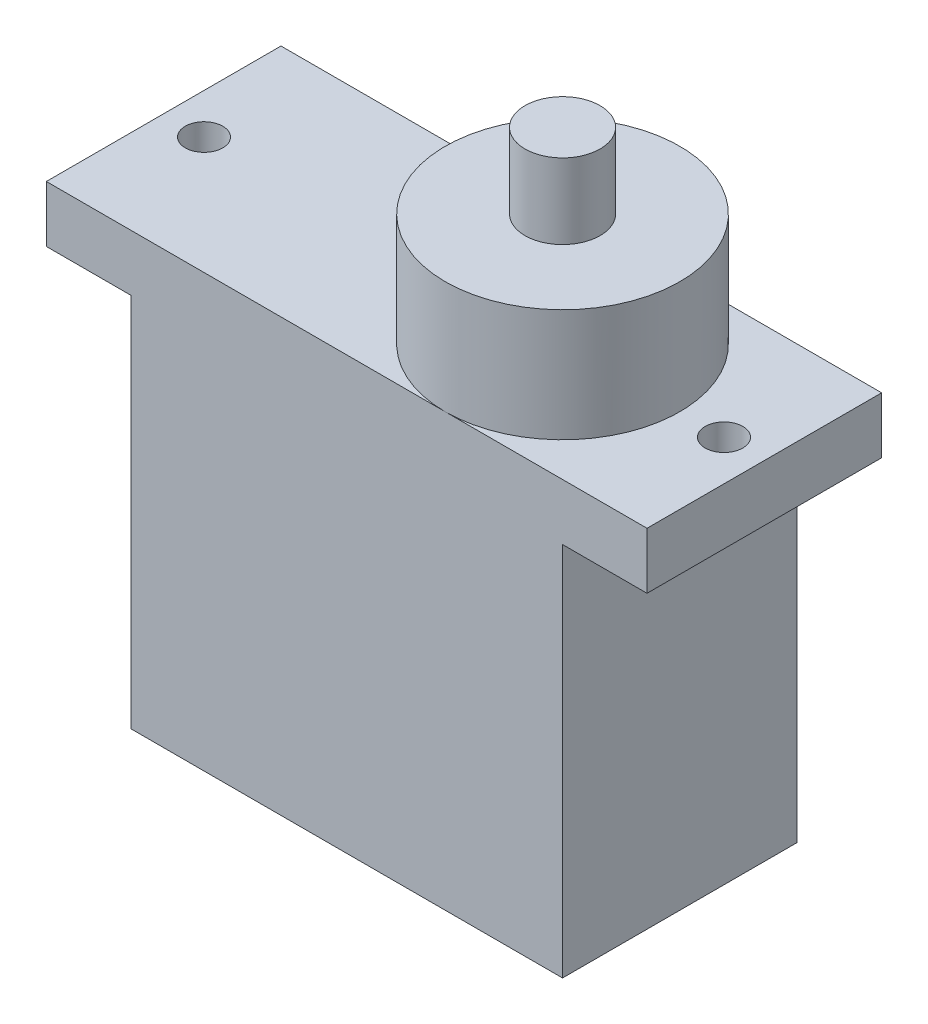
ISO-10303-21;
HEADER;
FILE_DESCRIPTION(('STEP AP214'),'2;1');
FILE_NAME('part.step','',(''),(''),'','','');
FILE_SCHEMA(('AUTOMOTIVE_DESIGN { 1 0 10303 214 1 1 1 1 }'));
ENDSEC;
DATA;
#1=APPLICATION_CONTEXT('core data for automotive mechanical design processes');
#2=APPLICATION_PROTOCOL_DEFINITION('international standard','automotive_design',2000,#1);
#3=PRODUCT_CONTEXT('',#1,'mechanical');
#4=PRODUCT('Part','Part','',(#3));
#5=PRODUCT_RELATED_PRODUCT_CATEGORY('part','',(#4));
#6=PRODUCT_DEFINITION_FORMATION('','',#4);
#7=PRODUCT_DEFINITION_CONTEXT('part definition',#1,'design');
#8=PRODUCT_DEFINITION('design','',#6,#7);
#9=PRODUCT_DEFINITION_SHAPE('','',#8);
#10=(LENGTH_UNIT() NAMED_UNIT(*) SI_UNIT(.MILLI.,.METRE.));
#11=(NAMED_UNIT(*) PLANE_ANGLE_UNIT() SI_UNIT($,.RADIAN.));
#12=(NAMED_UNIT(*) SI_UNIT($,.STERADIAN.) SOLID_ANGLE_UNIT());
#13=UNCERTAINTY_MEASURE_WITH_UNIT(LENGTH_MEASURE(1.E-05),#10,'distance_accuracy_value','');
#14=(GEOMETRIC_REPRESENTATION_CONTEXT(3) GLOBAL_UNCERTAINTY_ASSIGNED_CONTEXT((#13)) GLOBAL_UNIT_ASSIGNED_CONTEXT((#10,
#11,#12)) REPRESENTATION_CONTEXT('',''));
#15=CARTESIAN_POINT('',(0.,0.,0.));
#16=DIRECTION('',(0.,0.,1.));
#17=DIRECTION('',(1.,0.,0.));
#18=AXIS2_PLACEMENT_3D('',#15,#16,#17);
#19=CARTESIAN_POINT('',(0.,23.,0.));
#20=DIRECTION('',(0.,1.,0.));
#21=DIRECTION('',(0.,0.,1.));
#22=AXIS2_PLACEMENT_3D('',#19,#20,#21);
#23=PLANE('',#22);
#24=CARTESIAN_POINT('',(5.25,23.,0.));
#25=DIRECTION('',(0.,1.,0.));
#26=DIRECTION('',(0.,0.,1.));
#27=AXIS2_PLACEMENT_3D('',#24,#25,#26);
#28=CIRCLE('',#27,6.25);
#29=CARTESIAN_POINT('',(5.25,23.,6.25));
#30=VERTEX_POINT('',#29);
#31=CARTESIAN_POINT('',(5.25,23.,-6.25));
#32=VERTEX_POINT('',#31);
#33=EDGE_CURVE('E136',#30,#32,#28,.T.);
#34=ORIENTED_EDGE('',*,*,#33,.F.);
#35=DIRECTION('',(1.,0.,0.));
#36=VECTOR('',#35,1.);
#37=CARTESIAN_POINT('',(-16.,23.,6.25));
#38=LINE('',#37,#36);
#39=CARTESIAN_POINT('',(16.,23.,6.25));
#40=VERTEX_POINT('',#39);
#41=EDGE_CURVE('E125',#30,#40,#38,.T.);
#42=ORIENTED_EDGE('',*,*,#41,.T.);
#43=DIRECTION('',(0.,0.,-1.));
#44=VECTOR('',#43,1.);
#45=CARTESIAN_POINT('',(16.,23.,-6.25));
#46=LINE('',#45,#44);
#47=CARTESIAN_POINT('',(16.,23.,-6.25));
#48=VERTEX_POINT('',#47);
#49=EDGE_CURVE('E160',#40,#48,#46,.T.);
#50=ORIENTED_EDGE('',*,*,#49,.T.);
#51=DIRECTION('',(-1.,0.,0.));
#52=VECTOR('',#51,1.);
#53=CARTESIAN_POINT('',(-16.,23.,-6.25));
#54=LINE('',#53,#52);
#55=EDGE_CURVE('E138',#48,#32,#54,.T.);
#56=ORIENTED_EDGE('',*,*,#55,.T.);
#57=EDGE_LOOP('',(#34,#42,#50,#56));
#58=FACE_BOUND('',#57,.T.);
#59=CARTESIAN_POINT('',(13.85,23.,0.));
#60=DIRECTION('',(0.,1.,0.));
#61=DIRECTION('',(0.,0.,1.));
#62=AXIS2_PLACEMENT_3D('',#59,#60,#61);
#63=CIRCLE('',#62,1.);
#64=CARTESIAN_POINT('',(13.85,23.,0.999999999999999));
#65=VERTEX_POINT('',#64);
#66=EDGE_CURVE('E154',#65,#65,#63,.T.);
#67=ORIENTED_EDGE('',*,*,#66,.F.);
#68=EDGE_LOOP('',(#67));
#69=FACE_BOUND('',#68,.T.);
#70=ADVANCED_FACE('F39',(#58,#69),#23,.T.);
#71=CARTESIAN_POINT('',(11.5,20.,-6.25));
#72=DIRECTION('',(-1.,0.,0.));
#73=DIRECTION('',(0.,0.,1.));
#74=AXIS2_PLACEMENT_3D('',#71,#72,#73);
#75=PLANE('',#74);
#76=DIRECTION('',(0.,0.,-1.));
#77=VECTOR('',#76,1.);
#78=CARTESIAN_POINT('',(11.5,0.,-6.25));
#79=LINE('',#78,#77);
#80=CARTESIAN_POINT('',(11.5,0.,6.25));
#81=VERTEX_POINT('',#80);
#82=CARTESIAN_POINT('',(11.5,0.,-6.25));
#83=VERTEX_POINT('',#82);
#84=EDGE_CURVE('E186',#81,#83,#79,.T.);
#85=ORIENTED_EDGE('',*,*,#84,.T.);
#86=DIRECTION('',(0.,-1.,0.));
#87=VECTOR('',#86,1.);
#88=CARTESIAN_POINT('',(11.5,20.,-6.25));
#89=LINE('',#88,#87);
#90=CARTESIAN_POINT('',(11.5,20.,-6.25));
#91=VERTEX_POINT('',#90);
#92=EDGE_CURVE('E43',#91,#83,#89,.T.);
#93=ORIENTED_EDGE('',*,*,#92,.F.);
#94=DIRECTION('',(0.,0.,-1.));
#95=VECTOR('',#94,1.);
#96=CARTESIAN_POINT('',(11.5,20.,-6.25));
#97=LINE('',#96,#95);
#98=CARTESIAN_POINT('',(11.5,20.,6.25));
#99=VERTEX_POINT('',#98);
#100=EDGE_CURVE('E187',#99,#91,#97,.T.);
#101=ORIENTED_EDGE('',*,*,#100,.F.);
#102=DIRECTION('',(0.,-1.,0.));
#103=VECTOR('',#102,1.);
#104=CARTESIAN_POINT('',(11.5,20.,6.25));
#105=LINE('',#104,#103);
#106=EDGE_CURVE('E64',#99,#81,#105,.T.);
#107=ORIENTED_EDGE('',*,*,#106,.T.);
#108=EDGE_LOOP('',(#85,#93,#101,#107));
#109=FACE_BOUND('',#108,.T.);
#110=ADVANCED_FACE('F41',(#109),#75,.F.);
#111=CARTESIAN_POINT('',(-11.5,20.,-6.25));
#112=DIRECTION('',(0.,0.,1.));
#113=DIRECTION('',(1.,0.,0.));
#114=AXIS2_PLACEMENT_3D('',#111,#112,#113);
#115=PLANE('',#114);
#116=DIRECTION('',(-1.,0.,0.));
#117=VECTOR('',#116,1.);
#118=CARTESIAN_POINT('',(-11.5,0.,-6.25));
#119=LINE('',#118,#117);
#120=CARTESIAN_POINT('',(-11.5,0.,-6.25));
#121=VERTEX_POINT('',#120);
#122=EDGE_CURVE('E193',#83,#121,#119,.T.);
#123=ORIENTED_EDGE('',*,*,#122,.T.);
#124=DIRECTION('',(0.,-1.,0.));
#125=VECTOR('',#124,1.);
#126=CARTESIAN_POINT('',(-11.5,20.,-6.25));
#127=LINE('',#126,#125);
#128=CARTESIAN_POINT('',(-11.5,20.,-6.25));
#129=VERTEX_POINT('',#128);
#130=EDGE_CURVE('E144',#129,#121,#127,.T.);
#131=ORIENTED_EDGE('',*,*,#130,.F.);
#132=DIRECTION('',(-1.,0.,0.));
#133=VECTOR('',#132,1.);
#134=CARTESIAN_POINT('',(-16.,20.,-6.25));
#135=LINE('',#134,#133);
#136=CARTESIAN_POINT('',(-16.,20.,-6.25));
#137=VERTEX_POINT('',#136);
#138=EDGE_CURVE('E168',#129,#137,#135,.T.);
#139=ORIENTED_EDGE('',*,*,#138,.T.);
#140=DIRECTION('',(0.,-1.,0.));
#141=VECTOR('',#140,1.);
#142=CARTESIAN_POINT('',(-16.,23.,-6.25));
#143=LINE('',#142,#141);
#144=CARTESIAN_POINT('',(-16.,23.,-6.25));
#145=VERTEX_POINT('',#144);
#146=EDGE_CURVE('E180',#145,#137,#143,.T.);
#147=ORIENTED_EDGE('',*,*,#146,.F.);
#148=EDGE_CURVE('E162',#32,#145,#54,.T.);
#149=ORIENTED_EDGE('',*,*,#148,.F.);
#150=ORIENTED_EDGE('',*,*,#55,.F.);
#151=DIRECTION('',(0.,-1.,0.));
#152=VECTOR('',#151,1.);
#153=CARTESIAN_POINT('',(16.,23.,-6.25));
#154=LINE('',#153,#152);
#155=CARTESIAN_POINT('',(16.,20.,-6.25));
#156=VERTEX_POINT('',#155);
#157=EDGE_CURVE('E183',#48,#156,#154,.T.);
#158=ORIENTED_EDGE('',*,*,#157,.T.);
#159=EDGE_CURVE('E169',#156,#91,#135,.T.);
#160=ORIENTED_EDGE('',*,*,#159,.T.);
#161=ORIENTED_EDGE('',*,*,#92,.T.);
#162=EDGE_LOOP('',(#123,#131,#139,#147,#149,#150,#158,#160,#161));
#163=FACE_BOUND('',#162,.T.);
#164=ADVANCED_FACE('F217',(#163),#115,.F.);
#165=CARTESIAN_POINT('',(-11.5,20.,-6.25));
#166=DIRECTION('',(1.,0.,0.));
#167=DIRECTION('',(0.,0.,-1.));
#168=AXIS2_PLACEMENT_3D('',#165,#166,#167);
#169=PLANE('',#168);
#170=DIRECTION('',(0.,0.,1.));
#171=VECTOR('',#170,1.);
#172=CARTESIAN_POINT('',(-11.5,0.,-6.25));
#173=LINE('',#172,#171);
#174=CARTESIAN_POINT('',(-11.5,0.,6.25));
#175=VERTEX_POINT('',#174);
#176=EDGE_CURVE('E195',#121,#175,#173,.T.);
#177=ORIENTED_EDGE('',*,*,#176,.T.);
#178=DIRECTION('',(0.,-1.,0.));
#179=VECTOR('',#178,1.);
#180=CARTESIAN_POINT('',(-11.5,20.,6.25));
#181=LINE('',#180,#179);
#182=CARTESIAN_POINT('',(-11.5,20.,6.25));
#183=VERTEX_POINT('',#182);
#184=EDGE_CURVE('E199',#183,#175,#181,.T.);
#185=ORIENTED_EDGE('',*,*,#184,.F.);
#186=DIRECTION('',(0.,0.,1.));
#187=VECTOR('',#186,1.);
#188=CARTESIAN_POINT('',(-11.5,20.,-6.25));
#189=LINE('',#188,#187);
#190=EDGE_CURVE('E189',#129,#183,#189,.T.);
#191=ORIENTED_EDGE('',*,*,#190,.F.);
#192=ORIENTED_EDGE('',*,*,#130,.T.);
#193=EDGE_LOOP('',(#177,#185,#191,#192));
#194=FACE_BOUND('',#193,.T.);
#195=ADVANCED_FACE('F204',(#194),#169,.F.);
#196=CARTESIAN_POINT('',(-11.5,20.,6.25));
#197=DIRECTION('',(0.,0.,-1.));
#198=DIRECTION('',(-1.,0.,0.));
#199=AXIS2_PLACEMENT_3D('',#196,#197,#198);
#200=PLANE('',#199);
#201=DIRECTION('',(1.,0.,0.));
#202=VECTOR('',#201,1.);
#203=CARTESIAN_POINT('',(-11.5,0.,6.25));
#204=LINE('',#203,#202);
#205=EDGE_CURVE('E83',#175,#81,#204,.T.);
#206=ORIENTED_EDGE('',*,*,#205,.T.);
#207=ORIENTED_EDGE('',*,*,#106,.F.);
#208=DIRECTION('',(1.,0.,0.));
#209=VECTOR('',#208,1.);
#210=CARTESIAN_POINT('',(-16.,20.,6.25));
#211=LINE('',#210,#209);
#212=CARTESIAN_POINT('',(16.,20.,6.25));
#213=VERTEX_POINT('',#212);
#214=EDGE_CURVE('E174',#99,#213,#211,.T.);
#215=ORIENTED_EDGE('',*,*,#214,.T.);
#216=DIRECTION('',(0.,-1.,0.));
#217=VECTOR('',#216,1.);
#218=CARTESIAN_POINT('',(16.,23.,6.25));
#219=LINE('',#218,#217);
#220=EDGE_CURVE('E124',#40,#213,#219,.T.);
#221=ORIENTED_EDGE('',*,*,#220,.F.);
#222=ORIENTED_EDGE('',*,*,#41,.F.);
#223=CARTESIAN_POINT('',(-16.,23.,6.25));
#224=VERTEX_POINT('',#223);
#225=EDGE_CURVE('E116',#224,#30,#38,.T.);
#226=ORIENTED_EDGE('',*,*,#225,.F.);
#227=DIRECTION('',(0.,-1.,0.));
#228=VECTOR('',#227,1.);
#229=CARTESIAN_POINT('',(-16.,23.,6.25));
#230=LINE('',#229,#228);
#231=CARTESIAN_POINT('',(-16.,20.,6.25));
#232=VERTEX_POINT('',#231);
#233=EDGE_CURVE('E178',#224,#232,#230,.T.);
#234=ORIENTED_EDGE('',*,*,#233,.T.);
#235=EDGE_CURVE('E163',#232,#183,#211,.T.);
#236=ORIENTED_EDGE('',*,*,#235,.T.);
#237=ORIENTED_EDGE('',*,*,#184,.T.);
#238=EDGE_LOOP('',(#206,#207,#215,#221,#222,#226,#234,#236,#237));
#239=FACE_BOUND('',#238,.T.);
#240=ADVANCED_FACE('F129',(#239),#200,.F.);
#241=CARTESIAN_POINT('',(0.,0.,0.));
#242=DIRECTION('',(0.,1.,0.));
#243=DIRECTION('',(0.,0.,1.));
#244=AXIS2_PLACEMENT_3D('',#241,#242,#243);
#245=PLANE('',#244);
#246=ORIENTED_EDGE('',*,*,#84,.F.);
#247=ORIENTED_EDGE('',*,*,#205,.F.);
#248=ORIENTED_EDGE('',*,*,#176,.F.);
#249=ORIENTED_EDGE('',*,*,#122,.F.);
#250=EDGE_LOOP('',(#246,#247,#248,#249));
#251=FACE_BOUND('',#250,.T.);
#252=ADVANCED_FACE('F209',(#251),#245,.F.);
#253=CARTESIAN_POINT('',(0.,20.,0.));
#254=DIRECTION('',(0.,1.,0.));
#255=DIRECTION('',(0.,0.,1.));
#256=AXIS2_PLACEMENT_3D('',#253,#254,#255);
#257=PLANE('',#256);
#258=CARTESIAN_POINT('',(13.85,20.,0.));
#259=DIRECTION('',(0.,1.,0.));
#260=DIRECTION('',(0.,0.,1.));
#261=AXIS2_PLACEMENT_3D('',#258,#259,#260);
#262=CIRCLE('',#261,1.);
#263=CARTESIAN_POINT('',(13.85,20.,0.999999999999999));
#264=VERTEX_POINT('',#263);
#265=EDGE_CURVE('E150',#264,#264,#262,.T.);
#266=ORIENTED_EDGE('',*,*,#265,.T.);
#267=EDGE_LOOP('',(#266));
#268=FACE_BOUND('',#267,.T.);
#269=ORIENTED_EDGE('',*,*,#214,.F.);
#270=ORIENTED_EDGE('',*,*,#100,.T.);
#271=ORIENTED_EDGE('',*,*,#159,.F.);
#272=DIRECTION('',(0.,0.,-1.));
#273=VECTOR('',#272,1.);
#274=CARTESIAN_POINT('',(16.,20.,-6.25));
#275=LINE('',#274,#273);
#276=EDGE_CURVE('E157',#213,#156,#275,.T.);
#277=ORIENTED_EDGE('',*,*,#276,.F.);
#278=EDGE_LOOP('',(#269,#270,#271,#277));
#279=FACE_BOUND('',#278,.T.);
#280=ADVANCED_FACE('F213',(#268,#279),#257,.F.);
#281=CARTESIAN_POINT('',(-13.85,20.,0.));
#282=DIRECTION('',(0.,1.,0.));
#283=DIRECTION('',(0.,0.,-1.));
#284=AXIS2_PLACEMENT_3D('',#281,#282,#283);
#285=CIRCLE('',#284,1.);
#286=CARTESIAN_POINT('',(-13.85,20.,-1.));
#287=VERTEX_POINT('',#286);
#288=EDGE_CURVE('E151',#287,#287,#285,.T.);
#289=ORIENTED_EDGE('',*,*,#288,.T.);
#290=EDGE_LOOP('',(#289));
#291=FACE_BOUND('',#290,.T.);
#292=ORIENTED_EDGE('',*,*,#138,.F.);
#293=ORIENTED_EDGE('',*,*,#190,.T.);
#294=ORIENTED_EDGE('',*,*,#235,.F.);
#295=DIRECTION('',(0.,0.,1.));
#296=VECTOR('',#295,1.);
#297=CARTESIAN_POINT('',(-16.,20.,-6.25));
#298=LINE('',#297,#296);
#299=EDGE_CURVE('E172',#137,#232,#298,.T.);
#300=ORIENTED_EDGE('',*,*,#299,.F.);
#301=EDGE_LOOP('',(#292,#293,#294,#300));
#302=FACE_BOUND('',#301,.T.);
#303=ADVANCED_FACE('F224',(#291,#302),#257,.F.);
#304=EDGE_CURVE('E48',#32,#30,#28,.T.);
#305=ORIENTED_EDGE('',*,*,#304,.F.);
#306=ORIENTED_EDGE('',*,*,#148,.T.);
#307=DIRECTION('',(0.,0.,1.));
#308=VECTOR('',#307,1.);
#309=CARTESIAN_POINT('',(-16.,23.,-6.25));
#310=LINE('',#309,#308);
#311=EDGE_CURVE('E121',#145,#224,#310,.T.);
#312=ORIENTED_EDGE('',*,*,#311,.T.);
#313=ORIENTED_EDGE('',*,*,#225,.T.);
#314=EDGE_LOOP('',(#305,#306,#312,#313));
#315=FACE_BOUND('',#314,.T.);
#316=CARTESIAN_POINT('',(-13.85,23.,0.));
#317=DIRECTION('',(0.,1.,0.));
#318=DIRECTION('',(0.,0.,-1.));
#319=AXIS2_PLACEMENT_3D('',#316,#317,#318);
#320=CIRCLE('',#319,1.);
#321=CARTESIAN_POINT('',(-13.85,23.,-1.));
#322=VERTEX_POINT('',#321);
#323=EDGE_CURVE('E147',#322,#322,#320,.T.);
#324=ORIENTED_EDGE('',*,*,#323,.F.);
#325=EDGE_LOOP('',(#324));
#326=FACE_BOUND('',#325,.T.);
#327=ADVANCED_FACE('F118',(#315,#326),#23,.T.);
#328=CARTESIAN_POINT('',(16.,23.,-6.25));
#329=DIRECTION('',(-1.,0.,0.));
#330=DIRECTION('',(0.,0.,1.));
#331=AXIS2_PLACEMENT_3D('',#328,#329,#330);
#332=PLANE('',#331);
#333=ORIENTED_EDGE('',*,*,#276,.T.);
#334=ORIENTED_EDGE('',*,*,#157,.F.);
#335=ORIENTED_EDGE('',*,*,#49,.F.);
#336=ORIENTED_EDGE('',*,*,#220,.T.);
#337=EDGE_LOOP('',(#333,#334,#335,#336));
#338=FACE_BOUND('',#337,.T.);
#339=ADVANCED_FACE('F215',(#338),#332,.F.);
#340=CARTESIAN_POINT('',(-16.,23.,-6.25));
#341=DIRECTION('',(1.,0.,0.));
#342=DIRECTION('',(0.,0.,-1.));
#343=AXIS2_PLACEMENT_3D('',#340,#341,#342);
#344=PLANE('',#343);
#345=ORIENTED_EDGE('',*,*,#299,.T.);
#346=ORIENTED_EDGE('',*,*,#233,.F.);
#347=ORIENTED_EDGE('',*,*,#311,.F.);
#348=ORIENTED_EDGE('',*,*,#146,.T.);
#349=EDGE_LOOP('',(#345,#346,#347,#348));
#350=FACE_BOUND('',#349,.T.);
#351=ADVANCED_FACE('F221',(#350),#344,.F.);
#352=CARTESIAN_POINT('',(13.85,23.,0.));
#353=DIRECTION('',(0.,-1.,0.));
#354=DIRECTION('',(0.,0.,-1.));
#355=AXIS2_PLACEMENT_3D('',#352,#353,#354);
#356=CYLINDRICAL_SURFACE('',#355,1.);
#357=ORIENTED_EDGE('',*,*,#66,.T.);
#358=EDGE_LOOP('',(#357));
#359=FACE_BOUND('',#358,.T.);
#360=ORIENTED_EDGE('',*,*,#265,.F.);
#361=EDGE_LOOP('',(#360));
#362=FACE_BOUND('',#361,.T.);
#363=ADVANCED_FACE('F243',(#359,#362),#356,.F.);
#364=CARTESIAN_POINT('',(-13.85,23.,0.));
#365=DIRECTION('',(0.,-1.,0.));
#366=DIRECTION('',(0.,0.,-1.));
#367=AXIS2_PLACEMENT_3D('',#364,#365,#366);
#368=CYLINDRICAL_SURFACE('',#367,1.);
#369=ORIENTED_EDGE('',*,*,#323,.T.);
#370=EDGE_LOOP('',(#369));
#371=FACE_BOUND('',#370,.T.);
#372=ORIENTED_EDGE('',*,*,#288,.F.);
#373=EDGE_LOOP('',(#372));
#374=FACE_BOUND('',#373,.T.);
#375=ADVANCED_FACE('F246',(#371,#374),#368,.F.);
#376=CARTESIAN_POINT('',(5.25,29.,0.));
#377=DIRECTION('',(0.,-1.,0.));
#378=DIRECTION('',(0.,0.,-1.));
#379=AXIS2_PLACEMENT_3D('',#376,#377,#378);
#380=CYLINDRICAL_SURFACE('',#379,6.25);
#381=CARTESIAN_POINT('',(5.25,29.,0.));
#382=DIRECTION('',(0.,1.,0.));
#383=DIRECTION('',(0.,0.,1.));
#384=AXIS2_PLACEMENT_3D('',#381,#382,#383);
#385=CIRCLE('',#384,6.25);
#386=CARTESIAN_POINT('',(5.25,29.,6.25));
#387=VERTEX_POINT('',#386);
#388=EDGE_CURVE('E140',#387,#387,#385,.T.);
#389=ORIENTED_EDGE('',*,*,#388,.F.);
#390=EDGE_LOOP('',(#389));
#391=FACE_BOUND('',#390,.T.);
#392=ORIENTED_EDGE('',*,*,#33,.T.);
#393=ORIENTED_EDGE('',*,*,#304,.T.);
#394=EDGE_LOOP('',(#392,#393));
#395=FACE_BOUND('',#394,.T.);
#396=ADVANCED_FACE('F143',(#391,#395),#380,.T.);
#397=CARTESIAN_POINT('',(5.25,29.,0.));
#398=DIRECTION('',(0.,1.,0.));
#399=DIRECTION('',(0.,0.,1.));
#400=AXIS2_PLACEMENT_3D('',#397,#398,#399);
#401=PLANE('',#400);
#402=CARTESIAN_POINT('',(5.25,29.,0.));
#403=DIRECTION('',(0.,1.,0.));
#404=DIRECTION('',(0.,0.,1.));
#405=AXIS2_PLACEMENT_3D('',#402,#403,#404);
#406=CIRCLE('',#405,2.);
#407=CARTESIAN_POINT('',(5.25,29.,2.));
#408=VERTEX_POINT('',#407);
#409=EDGE_CURVE('E11',#408,#408,#406,.T.);
#410=ORIENTED_EDGE('',*,*,#409,.F.);
#411=EDGE_LOOP('',(#410));
#412=FACE_BOUND('',#411,.T.);
#413=ORIENTED_EDGE('',*,*,#388,.T.);
#414=EDGE_LOOP('',(#413));
#415=FACE_BOUND('',#414,.T.);
#416=ADVANCED_FACE('F252',(#412,#415),#401,.T.);
#417=CARTESIAN_POINT('',(5.25,33.,0.));
#418=DIRECTION('',(0.,-1.,0.));
#419=DIRECTION('',(0.,0.,-1.));
#420=AXIS2_PLACEMENT_3D('',#417,#418,#419);
#421=CYLINDRICAL_SURFACE('',#420,2.);
#422=CARTESIAN_POINT('',(5.25,33.,0.));
#423=DIRECTION('',(0.,1.,0.));
#424=DIRECTION('',(0.,0.,1.));
#425=AXIS2_PLACEMENT_3D('',#422,#423,#424);
#426=CIRCLE('',#425,2.);
#427=CARTESIAN_POINT('',(5.25,33.,2.));
#428=VERTEX_POINT('',#427);
#429=EDGE_CURVE('E141',#428,#428,#426,.T.);
#430=ORIENTED_EDGE('',*,*,#429,.F.);
#431=EDGE_LOOP('',(#430));
#432=FACE_BOUND('',#431,.T.);
#433=ORIENTED_EDGE('',*,*,#409,.T.);
#434=EDGE_LOOP('',(#433));
#435=FACE_BOUND('',#434,.T.);
#436=ADVANCED_FACE('F256',(#432,#435),#421,.T.);
#437=CARTESIAN_POINT('',(5.25,33.,0.));
#438=DIRECTION('',(0.,1.,0.));
#439=DIRECTION('',(0.,0.,1.));
#440=AXIS2_PLACEMENT_3D('',#437,#438,#439);
#441=PLANE('',#440);
#442=ORIENTED_EDGE('',*,*,#429,.T.);
#443=EDGE_LOOP('',(#442));
#444=FACE_BOUND('',#443,.T.);
#445=ADVANCED_FACE('F260',(#444),#441,.T.);
#446=CLOSED_SHELL('',(#70,#110,#164,#195,#240,#252,#280,#303,#327,#339,#351,#363,#375,#396,#416,
#436,#445));
#447=MANIFOLD_SOLID_BREP('B2',#446);
#448=ADVANCED_BREP_SHAPE_REPRESENTATION('',(#18,#447),#14);
#449=SHAPE_DEFINITION_REPRESENTATION(#9,#448);
ENDSEC;
END-ISO-10303-21;
